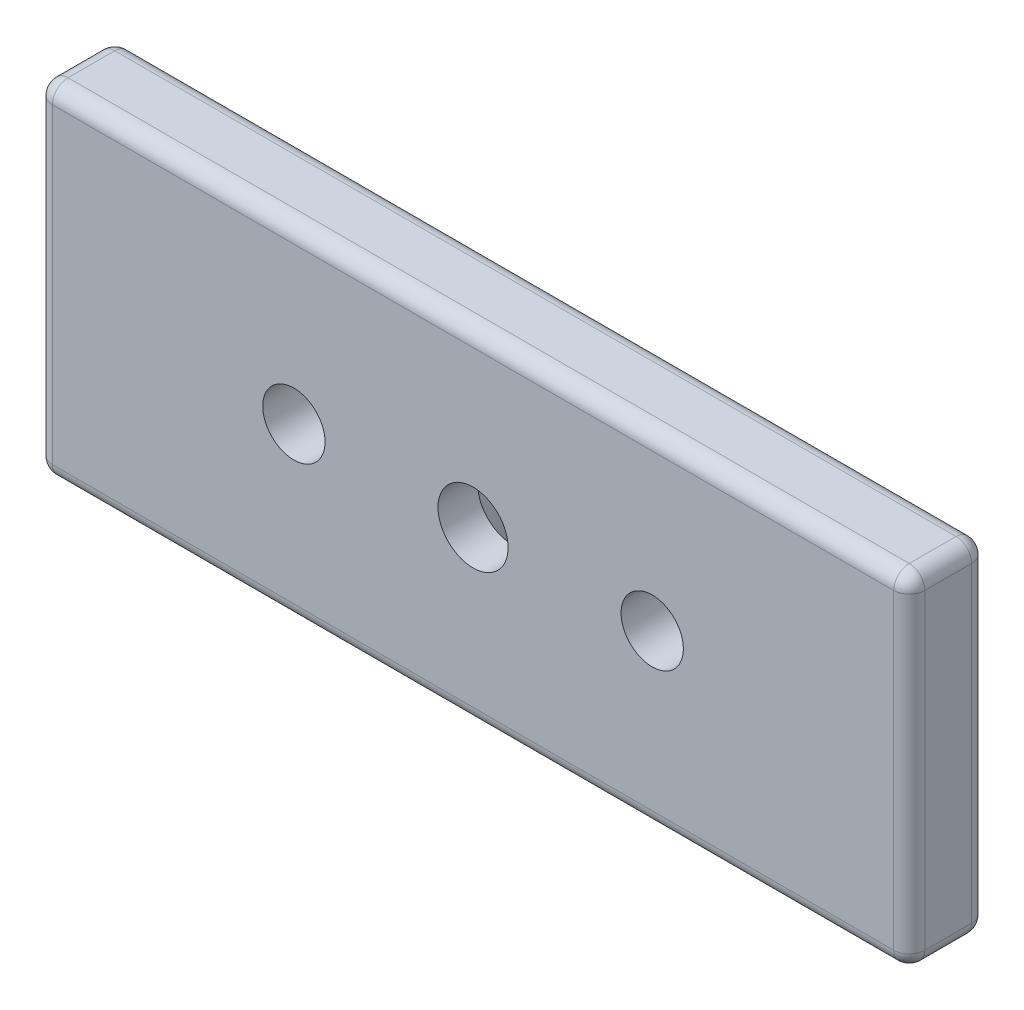
ISO-10303-21;
HEADER;
FILE_DESCRIPTION(('STEP AP214'),'2;1');
FILE_NAME('part.step','',(''),(''),'','','');
FILE_SCHEMA(('AUTOMOTIVE_DESIGN { 1 0 10303 214 1 1 1 1 }'));
ENDSEC;
DATA;
#1=APPLICATION_CONTEXT('core data for automotive mechanical design processes');
#2=APPLICATION_PROTOCOL_DEFINITION('international standard','automotive_design',2000,#1);
#3=PRODUCT_CONTEXT('',#1,'mechanical');
#4=PRODUCT('Part','Part','',(#3));
#5=PRODUCT_RELATED_PRODUCT_CATEGORY('part','',(#4));
#6=PRODUCT_DEFINITION_FORMATION('','',#4);
#7=PRODUCT_DEFINITION_CONTEXT('part definition',#1,'design');
#8=PRODUCT_DEFINITION('design','',#6,#7);
#9=PRODUCT_DEFINITION_SHAPE('','',#8);
#10=(LENGTH_UNIT() NAMED_UNIT(*) SI_UNIT(.MILLI.,.METRE.));
#11=(NAMED_UNIT(*) PLANE_ANGLE_UNIT() SI_UNIT($,.RADIAN.));
#12=(NAMED_UNIT(*) SI_UNIT($,.STERADIAN.) SOLID_ANGLE_UNIT());
#13=UNCERTAINTY_MEASURE_WITH_UNIT(LENGTH_MEASURE(1.E-05),#10,'distance_accuracy_value','');
#14=(GEOMETRIC_REPRESENTATION_CONTEXT(3) GLOBAL_UNCERTAINTY_ASSIGNED_CONTEXT((#13)) GLOBAL_UNIT_ASSIGNED_CONTEXT((#10,
#11,#12)) REPRESENTATION_CONTEXT('',''));
#15=CARTESIAN_POINT('',(0.,0.,0.));
#16=DIRECTION('',(0.,0.,1.));
#17=DIRECTION('',(1.,0.,0.));
#18=AXIS2_PLACEMENT_3D('',#15,#16,#17);
#19=CARTESIAN_POINT('',(0.,0.,-5.));
#20=DIRECTION('',(-1.,0.,0.));
#21=DIRECTION('',(0.,0.,1.));
#22=AXIS2_PLACEMENT_3D('',#19,#20,#21);
#23=PLANE('',#22);
#24=DIRECTION('',(0.,0.,1.));
#25=VECTOR('',#24,1.);
#26=CARTESIAN_POINT('',(0.,21.,-5.));
#27=LINE('',#26,#25);
#28=CARTESIAN_POINT('',(0.,21.,-1.));
#29=VERTEX_POINT('',#28);
#30=CARTESIAN_POINT('',(0.,21.,-4.));
#31=VERTEX_POINT('',#30);
#32=EDGE_CURVE('E254',#29,#31,#27,.F.);
#33=ORIENTED_EDGE('',*,*,#32,.T.);
#34=DIRECTION('',(0.,-1.,0.));
#35=VECTOR('',#34,1.);
#36=CARTESIAN_POINT('',(0.,0.,-4.));
#37=LINE('',#36,#35);
#38=CARTESIAN_POINT('',(0.,1.,-4.));
#39=VERTEX_POINT('',#38);
#40=EDGE_CURVE('E316',#31,#39,#37,.T.);
#41=ORIENTED_EDGE('',*,*,#40,.T.);
#42=DIRECTION('',(0.,0.,1.));
#43=VECTOR('',#42,1.);
#44=CARTESIAN_POINT('',(0.,1.,-5.));
#45=LINE('',#44,#43);
#46=CARTESIAN_POINT('',(0.,1.,-1.));
#47=VERTEX_POINT('',#46);
#48=EDGE_CURVE('E258',#39,#47,#45,.T.);
#49=ORIENTED_EDGE('',*,*,#48,.T.);
#50=DIRECTION('',(0.,-1.,0.));
#51=VECTOR('',#50,1.);
#52=CARTESIAN_POINT('',(0.,21.,-1.));
#53=LINE('',#52,#51);
#54=EDGE_CURVE('E313',#47,#29,#53,.F.);
#55=ORIENTED_EDGE('',*,*,#54,.T.);
#56=EDGE_LOOP('',(#33,#41,#49,#55));
#57=FACE_BOUND('',#56,.T.);
#58=ADVANCED_FACE('F40',(#57),#23,.T.);
#59=CARTESIAN_POINT('',(0.,22.,-5.));
#60=DIRECTION('',(0.,1.,0.));
#61=DIRECTION('',(0.,0.,1.));
#62=AXIS2_PLACEMENT_3D('',#59,#60,#61);
#63=PLANE('',#62);
#64=DIRECTION('',(0.,0.,1.));
#65=VECTOR('',#64,1.);
#66=CARTESIAN_POINT('',(55.,22.,-5.));
#67=LINE('',#66,#65);
#68=CARTESIAN_POINT('',(55.,22.,-1.));
#69=VERTEX_POINT('',#68);
#70=CARTESIAN_POINT('',(55.,22.,-4.));
#71=VERTEX_POINT('',#70);
#72=EDGE_CURVE('E134',#69,#71,#67,.F.);
#73=ORIENTED_EDGE('',*,*,#72,.T.);
#74=DIRECTION('',(-1.,0.,0.));
#75=VECTOR('',#74,1.);
#76=CARTESIAN_POINT('',(0.,22.,-4.));
#77=LINE('',#76,#75);
#78=CARTESIAN_POINT('',(1.,22.,-4.));
#79=VERTEX_POINT('',#78);
#80=EDGE_CURVE('E11',#71,#79,#77,.T.);
#81=ORIENTED_EDGE('',*,*,#80,.T.);
#82=DIRECTION('',(0.,0.,1.));
#83=VECTOR('',#82,1.);
#84=CARTESIAN_POINT('',(1.,22.,-5.));
#85=LINE('',#84,#83);
#86=CARTESIAN_POINT('',(1.,22.,-1.));
#87=VERTEX_POINT('',#86);
#88=EDGE_CURVE('E136',#79,#87,#85,.T.);
#89=ORIENTED_EDGE('',*,*,#88,.T.);
#90=DIRECTION('',(-1.,0.,0.));
#91=VECTOR('',#90,1.);
#92=CARTESIAN_POINT('',(55.,22.,-1.));
#93=LINE('',#92,#91);
#94=EDGE_CURVE('E50',#87,#69,#93,.F.);
#95=ORIENTED_EDGE('',*,*,#94,.T.);
#96=EDGE_LOOP('',(#73,#81,#89,#95));
#97=FACE_BOUND('',#96,.T.);
#98=ADVANCED_FACE('F133',(#97),#63,.T.);
#99=CARTESIAN_POINT('',(56.,0.,-5.));
#100=DIRECTION('',(1.,0.,0.));
#101=DIRECTION('',(0.,0.,-1.));
#102=AXIS2_PLACEMENT_3D('',#99,#100,#101);
#103=PLANE('',#102);
#104=DIRECTION('',(0.,0.,1.));
#105=VECTOR('',#104,1.);
#106=CARTESIAN_POINT('',(56.,1.,-5.));
#107=LINE('',#106,#105);
#108=CARTESIAN_POINT('',(56.,1.,-1.));
#109=VERTEX_POINT('',#108);
#110=CARTESIAN_POINT('',(56.,1.,-4.));
#111=VERTEX_POINT('',#110);
#112=EDGE_CURVE('E274',#109,#111,#107,.F.);
#113=ORIENTED_EDGE('',*,*,#112,.T.);
#114=DIRECTION('',(0.,1.,0.));
#115=VECTOR('',#114,1.);
#116=CARTESIAN_POINT('',(56.,0.,-4.));
#117=LINE('',#116,#115);
#118=CARTESIAN_POINT('',(56.,21.,-4.));
#119=VERTEX_POINT('',#118);
#120=EDGE_CURVE('E285',#111,#119,#117,.T.);
#121=ORIENTED_EDGE('',*,*,#120,.T.);
#122=DIRECTION('',(0.,0.,1.));
#123=VECTOR('',#122,1.);
#124=CARTESIAN_POINT('',(56.,21.,-5.));
#125=LINE('',#124,#123);
#126=CARTESIAN_POINT('',(56.,21.,-1.));
#127=VERTEX_POINT('',#126);
#128=EDGE_CURVE('E271',#119,#127,#125,.T.);
#129=ORIENTED_EDGE('',*,*,#128,.T.);
#130=DIRECTION('',(0.,1.,0.));
#131=VECTOR('',#130,1.);
#132=CARTESIAN_POINT('',(56.,1.,-1.));
#133=LINE('',#132,#131);
#134=EDGE_CURVE('E282',#127,#109,#133,.F.);
#135=ORIENTED_EDGE('',*,*,#134,.T.);
#136=EDGE_LOOP('',(#113,#121,#129,#135));
#137=FACE_BOUND('',#136,.T.);
#138=ADVANCED_FACE('F357',(#137),#103,.T.);
#139=CARTESIAN_POINT('',(0.,0.,-5.));
#140=DIRECTION('',(0.,-1.,0.));
#141=DIRECTION('',(0.,0.,-1.));
#142=AXIS2_PLACEMENT_3D('',#139,#140,#141);
#143=PLANE('',#142);
#144=DIRECTION('',(0.,0.,1.));
#145=VECTOR('',#144,1.);
#146=CARTESIAN_POINT('',(1.,0.,-5.));
#147=LINE('',#146,#145);
#148=CARTESIAN_POINT('',(1.,0.,-1.));
#149=VERTEX_POINT('',#148);
#150=CARTESIAN_POINT('',(1.,0.,-4.));
#151=VERTEX_POINT('',#150);
#152=EDGE_CURVE('E267',#149,#151,#147,.F.);
#153=ORIENTED_EDGE('',*,*,#152,.T.);
#154=DIRECTION('',(1.,0.,0.));
#155=VECTOR('',#154,1.);
#156=CARTESIAN_POINT('',(0.,0.,-4.));
#157=LINE('',#156,#155);
#158=CARTESIAN_POINT('',(55.,0.,-4.));
#159=VERTEX_POINT('',#158);
#160=EDGE_CURVE('E142',#151,#159,#157,.T.);
#161=ORIENTED_EDGE('',*,*,#160,.T.);
#162=DIRECTION('',(0.,0.,1.));
#163=VECTOR('',#162,1.);
#164=CARTESIAN_POINT('',(55.,0.,-5.));
#165=LINE('',#164,#163);
#166=CARTESIAN_POINT('',(55.,0.,-1.));
#167=VERTEX_POINT('',#166);
#168=EDGE_CURVE('E263',#159,#167,#165,.T.);
#169=ORIENTED_EDGE('',*,*,#168,.T.);
#170=DIRECTION('',(1.,0.,0.));
#171=VECTOR('',#170,1.);
#172=CARTESIAN_POINT('',(1.,0.,-1.));
#173=LINE('',#172,#171);
#174=EDGE_CURVE('E334',#167,#149,#173,.F.);
#175=ORIENTED_EDGE('',*,*,#174,.T.);
#176=EDGE_LOOP('',(#153,#161,#169,#175));
#177=FACE_BOUND('',#176,.T.);
#178=ADVANCED_FACE('F340',(#177),#143,.T.);
#179=CARTESIAN_POINT('',(0.,0.,-5.));
#180=DIRECTION('',(0.,0.,-1.));
#181=DIRECTION('',(-1.,0.,0.));
#182=AXIS2_PLACEMENT_3D('',#179,#180,#181);
#183=PLANE('',#182);
#184=CARTESIAN_POINT('',(28.,11.,-5.));
#185=DIRECTION('',(0.,0.,-1.));
#186=DIRECTION('',(-1.,0.,0.));
#187=AXIS2_PLACEMENT_3D('',#184,#185,#186);
#188=CIRCLE('',#187,4.7);
#189=CARTESIAN_POINT('',(23.3,11.,-5.));
#190=VERTEX_POINT('',#189);
#191=EDGE_CURVE('E660',#190,#190,#188,.T.);
#192=ORIENTED_EDGE('',*,*,#191,.F.);
#193=EDGE_LOOP('',(#192));
#194=FACE_BOUND('',#193,.T.);
#195=DIRECTION('',(0.,1.,0.));
#196=VECTOR('',#195,1.);
#197=CARTESIAN_POINT('',(55.,0.,-5.));
#198=LINE('',#197,#196);
#199=CARTESIAN_POINT('',(55.,21.,-5.));
#200=VERTEX_POINT('',#199);
#201=CARTESIAN_POINT('',(55.,1.,-5.));
#202=VERTEX_POINT('',#201);
#203=EDGE_CURVE('E294',#200,#202,#198,.F.);
#204=ORIENTED_EDGE('',*,*,#203,.T.);
#205=DIRECTION('',(1.,0.,0.));
#206=VECTOR('',#205,1.);
#207=CARTESIAN_POINT('',(0.,1.,-5.));
#208=LINE('',#207,#206);
#209=CARTESIAN_POINT('',(1.,1.,-5.));
#210=VERTEX_POINT('',#209);
#211=EDGE_CURVE('E298',#202,#210,#208,.F.);
#212=ORIENTED_EDGE('',*,*,#211,.T.);
#213=DIRECTION('',(0.,-1.,0.));
#214=VECTOR('',#213,1.);
#215=CARTESIAN_POINT('',(1.,0.,-5.));
#216=LINE('',#215,#214);
#217=CARTESIAN_POINT('',(1.,21.,-5.));
#218=VERTEX_POINT('',#217);
#219=EDGE_CURVE('E291',#210,#218,#216,.F.);
#220=ORIENTED_EDGE('',*,*,#219,.T.);
#221=DIRECTION('',(-1.,0.,0.));
#222=VECTOR('',#221,1.);
#223=CARTESIAN_POINT('',(0.,21.,-5.));
#224=LINE('',#223,#222);
#225=EDGE_CURVE('E288',#218,#200,#224,.F.);
#226=ORIENTED_EDGE('',*,*,#225,.T.);
#227=EDGE_LOOP('',(#204,#212,#220,#226));
#228=FACE_BOUND('',#227,.T.);
#229=CARTESIAN_POINT('',(16.5,11.,-5.));
#230=DIRECTION('',(0.,0.,1.));
#231=DIRECTION('',(1.,0.,0.));
#232=AXIS2_PLACEMENT_3D('',#229,#230,#231);
#233=CIRCLE('',#232,2.);
#234=CARTESIAN_POINT('',(18.5,11.,-5.));
#235=VERTEX_POINT('',#234);
#236=EDGE_CURVE('E259',#235,#235,#233,.T.);
#237=ORIENTED_EDGE('',*,*,#236,.T.);
#238=EDGE_LOOP('',(#237));
#239=FACE_BOUND('',#238,.T.);
#240=CARTESIAN_POINT('',(39.5,11.,-5.));
#241=DIRECTION('',(0.,0.,1.));
#242=DIRECTION('',(1.,0.,0.));
#243=AXIS2_PLACEMENT_3D('',#240,#241,#242);
#244=CIRCLE('',#243,2.);
#245=CARTESIAN_POINT('',(41.5,11.,-5.));
#246=VERTEX_POINT('',#245);
#247=EDGE_CURVE('E244',#246,#246,#244,.T.);
#248=ORIENTED_EDGE('',*,*,#247,.T.);
#249=EDGE_LOOP('',(#248));
#250=FACE_BOUND('',#249,.T.);
#251=ADVANCED_FACE('F616',(#194,#228,#239,#250),#183,.T.);
#252=CARTESIAN_POINT('',(0.,0.,0.));
#253=DIRECTION('',(0.,0.,-1.));
#254=DIRECTION('',(-1.,0.,0.));
#255=AXIS2_PLACEMENT_3D('',#252,#253,#254);
#256=PLANE('',#255);
#257=CARTESIAN_POINT('',(28.,11.,0.));
#258=DIRECTION('',(0.,0.,-1.));
#259=DIRECTION('',(-1.,0.,0.));
#260=AXIS2_PLACEMENT_3D('',#257,#258,#259);
#261=CIRCLE('',#260,2.25);
#262=CARTESIAN_POINT('',(25.75,11.,0.));
#263=VERTEX_POINT('',#262);
#264=EDGE_CURVE('E168',#263,#263,#261,.T.);
#265=ORIENTED_EDGE('',*,*,#264,.T.);
#266=EDGE_LOOP('',(#265));
#267=FACE_BOUND('',#266,.T.);
#268=DIRECTION('',(0.,-1.,0.));
#269=VECTOR('',#268,1.);
#270=CARTESIAN_POINT('',(1.,1.,0.));
#271=LINE('',#270,#269);
#272=CARTESIAN_POINT('',(1.,21.,0.));
#273=VERTEX_POINT('',#272);
#274=CARTESIAN_POINT('',(1.,1.,0.));
#275=VERTEX_POINT('',#274);
#276=EDGE_CURVE('E63',#273,#275,#271,.T.);
#277=ORIENTED_EDGE('',*,*,#276,.T.);
#278=DIRECTION('',(1.,0.,0.));
#279=VECTOR('',#278,1.);
#280=CARTESIAN_POINT('',(55.,1.,0.));
#281=LINE('',#280,#279);
#282=CARTESIAN_POINT('',(55.,1.,0.));
#283=VERTEX_POINT('',#282);
#284=EDGE_CURVE('E58',#275,#283,#281,.T.);
#285=ORIENTED_EDGE('',*,*,#284,.T.);
#286=DIRECTION('',(0.,1.,0.));
#287=VECTOR('',#286,1.);
#288=CARTESIAN_POINT('',(55.,21.,0.));
#289=LINE('',#288,#287);
#290=CARTESIAN_POINT('',(55.,21.,0.));
#291=VERTEX_POINT('',#290);
#292=EDGE_CURVE('E329',#283,#291,#289,.T.);
#293=ORIENTED_EDGE('',*,*,#292,.T.);
#294=DIRECTION('',(-1.,0.,0.));
#295=VECTOR('',#294,1.);
#296=CARTESIAN_POINT('',(1.,21.,0.));
#297=LINE('',#296,#295);
#298=EDGE_CURVE('E166',#291,#273,#297,.T.);
#299=ORIENTED_EDGE('',*,*,#298,.T.);
#300=EDGE_LOOP('',(#277,#285,#293,#299));
#301=FACE_BOUND('',#300,.T.);
#302=CARTESIAN_POINT('',(16.5,11.,0.));
#303=DIRECTION('',(0.,0.,1.));
#304=DIRECTION('',(1.,0.,0.));
#305=AXIS2_PLACEMENT_3D('',#302,#303,#304);
#306=CIRCLE('',#305,2.);
#307=CARTESIAN_POINT('',(18.5,11.,0.));
#308=VERTEX_POINT('',#307);
#309=EDGE_CURVE('E250',#308,#308,#306,.T.);
#310=ORIENTED_EDGE('',*,*,#309,.F.);
#311=EDGE_LOOP('',(#310));
#312=FACE_BOUND('',#311,.T.);
#313=CARTESIAN_POINT('',(39.5,11.,0.));
#314=DIRECTION('',(0.,0.,1.));
#315=DIRECTION('',(1.,0.,0.));
#316=AXIS2_PLACEMENT_3D('',#313,#314,#315);
#317=CIRCLE('',#316,2.);
#318=CARTESIAN_POINT('',(41.5,11.,0.));
#319=VERTEX_POINT('',#318);
#320=EDGE_CURVE('E238',#319,#319,#317,.T.);
#321=ORIENTED_EDGE('',*,*,#320,.F.);
#322=EDGE_LOOP('',(#321));
#323=FACE_BOUND('',#322,.T.);
#324=ADVANCED_FACE('F608',(#267,#301,#312,#323),#256,.F.);
#325=CARTESIAN_POINT('',(39.5,11.,-5.));
#326=DIRECTION('',(0.,0.,1.));
#327=DIRECTION('',(1.,0.,0.));
#328=AXIS2_PLACEMENT_3D('',#325,#326,#327);
#329=CYLINDRICAL_SURFACE('',#328,2.);
#330=ORIENTED_EDGE('',*,*,#247,.F.);
#331=EDGE_LOOP('',(#330));
#332=FACE_BOUND('',#331,.T.);
#333=ORIENTED_EDGE('',*,*,#320,.T.);
#334=EDGE_LOOP('',(#333));
#335=FACE_BOUND('',#334,.T.);
#336=ADVANCED_FACE('F599',(#332,#335),#329,.F.);
#337=CARTESIAN_POINT('',(16.5,11.,-5.));
#338=DIRECTION('',(0.,0.,1.));
#339=DIRECTION('',(1.,0.,0.));
#340=AXIS2_PLACEMENT_3D('',#337,#338,#339);
#341=CYLINDRICAL_SURFACE('',#340,2.);
#342=ORIENTED_EDGE('',*,*,#236,.F.);
#343=EDGE_LOOP('',(#342));
#344=FACE_BOUND('',#343,.T.);
#345=ORIENTED_EDGE('',*,*,#309,.T.);
#346=EDGE_LOOP('',(#345));
#347=FACE_BOUND('',#346,.T.);
#348=ADVANCED_FACE('F402',(#344,#347),#341,.F.);
#349=CARTESIAN_POINT('',(1.,1.,-5.));
#350=DIRECTION('',(0.,0.,1.));
#351=DIRECTION('',(1.,0.,0.));
#352=AXIS2_PLACEMENT_3D('',#349,#350,#351);
#353=CYLINDRICAL_SURFACE('',#352,1.);
#354=ORIENTED_EDGE('',*,*,#48,.F.);
#355=CARTESIAN_POINT('',(1.,1.,-4.));
#356=DIRECTION('',(0.,0.,1.));
#357=DIRECTION('',(1.,0.,0.));
#358=AXIS2_PLACEMENT_3D('',#355,#356,#357);
#359=CIRCLE('',#358,1.);
#360=EDGE_CURVE('E310',#39,#151,#359,.T.);
#361=ORIENTED_EDGE('',*,*,#360,.T.);
#362=ORIENTED_EDGE('',*,*,#152,.F.);
#363=CARTESIAN_POINT('',(1.,1.,-1.));
#364=DIRECTION('',(0.,0.,1.));
#365=DIRECTION('',(1.,0.,0.));
#366=AXIS2_PLACEMENT_3D('',#363,#364,#365);
#367=CIRCLE('',#366,1.);
#368=EDGE_CURVE('E307',#149,#47,#367,.F.);
#369=ORIENTED_EDGE('',*,*,#368,.T.);
#370=EDGE_LOOP('',(#354,#361,#362,#369));
#371=FACE_BOUND('',#370,.T.);
#372=ADVANCED_FACE('F378',(#371),#353,.T.);
#373=CARTESIAN_POINT('',(55.,1.,-5.));
#374=DIRECTION('',(0.,0.,1.));
#375=DIRECTION('',(1.,0.,0.));
#376=AXIS2_PLACEMENT_3D('',#373,#374,#375);
#377=CYLINDRICAL_SURFACE('',#376,1.);
#378=ORIENTED_EDGE('',*,*,#168,.F.);
#379=CARTESIAN_POINT('',(55.,1.,-4.));
#380=DIRECTION('',(0.,0.,1.));
#381=DIRECTION('',(1.,0.,0.));
#382=AXIS2_PLACEMENT_3D('',#379,#380,#381);
#383=CIRCLE('',#382,1.);
#384=EDGE_CURVE('E304',#159,#111,#383,.T.);
#385=ORIENTED_EDGE('',*,*,#384,.T.);
#386=ORIENTED_EDGE('',*,*,#112,.F.);
#387=CARTESIAN_POINT('',(55.,1.,-1.));
#388=DIRECTION('',(0.,0.,1.));
#389=DIRECTION('',(1.,0.,0.));
#390=AXIS2_PLACEMENT_3D('',#387,#388,#389);
#391=CIRCLE('',#390,1.);
#392=EDGE_CURVE('E301',#109,#167,#391,.F.);
#393=ORIENTED_EDGE('',*,*,#392,.T.);
#394=EDGE_LOOP('',(#378,#385,#386,#393));
#395=FACE_BOUND('',#394,.T.);
#396=ADVANCED_FACE('F344',(#395),#377,.T.);
#397=CARTESIAN_POINT('',(55.,21.,-5.));
#398=DIRECTION('',(0.,0.,1.));
#399=DIRECTION('',(1.,0.,0.));
#400=AXIS2_PLACEMENT_3D('',#397,#398,#399);
#401=CYLINDRICAL_SURFACE('',#400,1.);
#402=ORIENTED_EDGE('',*,*,#128,.F.);
#403=CARTESIAN_POINT('',(55.,21.,-4.));
#404=DIRECTION('',(0.,0.,1.));
#405=DIRECTION('',(1.,0.,0.));
#406=AXIS2_PLACEMENT_3D('',#403,#404,#405);
#407=CIRCLE('',#406,1.);
#408=EDGE_CURVE('E153',#119,#71,#407,.T.);
#409=ORIENTED_EDGE('',*,*,#408,.T.);
#410=ORIENTED_EDGE('',*,*,#72,.F.);
#411=CARTESIAN_POINT('',(55.,21.,-1.));
#412=DIRECTION('',(0.,0.,1.));
#413=DIRECTION('',(1.,0.,0.));
#414=AXIS2_PLACEMENT_3D('',#411,#412,#413);
#415=CIRCLE('',#414,1.);
#416=EDGE_CURVE('E150',#69,#127,#415,.F.);
#417=ORIENTED_EDGE('',*,*,#416,.T.);
#418=EDGE_LOOP('',(#402,#409,#410,#417));
#419=FACE_BOUND('',#418,.T.);
#420=ADVANCED_FACE('F149',(#419),#401,.T.);
#421=CARTESIAN_POINT('',(1.,21.,-5.));
#422=DIRECTION('',(0.,0.,1.));
#423=DIRECTION('',(1.,0.,0.));
#424=AXIS2_PLACEMENT_3D('',#421,#422,#423);
#425=CYLINDRICAL_SURFACE('',#424,1.);
#426=ORIENTED_EDGE('',*,*,#88,.F.);
#427=CARTESIAN_POINT('',(1.,21.,-4.));
#428=DIRECTION('',(0.,0.,1.));
#429=DIRECTION('',(1.,0.,0.));
#430=AXIS2_PLACEMENT_3D('',#427,#428,#429);
#431=CIRCLE('',#430,1.);
#432=EDGE_CURVE('E322',#79,#31,#431,.T.);
#433=ORIENTED_EDGE('',*,*,#432,.T.);
#434=ORIENTED_EDGE('',*,*,#32,.F.);
#435=CARTESIAN_POINT('',(1.,21.,-1.));
#436=DIRECTION('',(0.,0.,1.));
#437=DIRECTION('',(1.,0.,0.));
#438=AXIS2_PLACEMENT_3D('',#435,#436,#437);
#439=CIRCLE('',#438,1.);
#440=EDGE_CURVE('E319',#29,#87,#439,.F.);
#441=ORIENTED_EDGE('',*,*,#440,.T.);
#442=EDGE_LOOP('',(#426,#433,#434,#441));
#443=FACE_BOUND('',#442,.T.);
#444=ADVANCED_FACE('F367',(#443),#425,.T.);
#445=CARTESIAN_POINT('',(1.,1.,-4.));
#446=DIRECTION('',(0.,0.,-1.));
#447=DIRECTION('',(-1.,0.,0.));
#448=AXIS2_PLACEMENT_3D('',#445,#446,#447);
#449=SPHERICAL_SURFACE('',#448,1.);
#450=CARTESIAN_POINT('',(1.,1.,-4.));
#451=DIRECTION('',(1.,0.,0.));
#452=DIRECTION('',(0.,0.,-1.));
#453=AXIS2_PLACEMENT_3D('',#450,#451,#452);
#454=CIRCLE('',#453,1.);
#455=EDGE_CURVE('E228',#151,#210,#454,.T.);
#456=ORIENTED_EDGE('',*,*,#455,.F.);
#457=ORIENTED_EDGE('',*,*,#360,.F.);
#458=CARTESIAN_POINT('',(1.,1.,-4.));
#459=DIRECTION('',(0.,1.,0.));
#460=DIRECTION('',(0.,0.,1.));
#461=AXIS2_PLACEMENT_3D('',#458,#459,#460);
#462=CIRCLE('',#461,1.);
#463=EDGE_CURVE('E178',#210,#39,#462,.T.);
#464=ORIENTED_EDGE('',*,*,#463,.F.);
#465=EDGE_LOOP('',(#456,#457,#464));
#466=FACE_BOUND('',#465,.T.);
#467=ADVANCED_FACE('F381',(#466),#449,.T.);
#468=CARTESIAN_POINT('',(1.,0.,-4.));
#469=DIRECTION('',(0.,-1.,0.));
#470=DIRECTION('',(0.,0.,-1.));
#471=AXIS2_PLACEMENT_3D('',#468,#469,#470);
#472=CYLINDRICAL_SURFACE('',#471,1.);
#473=ORIENTED_EDGE('',*,*,#463,.T.);
#474=ORIENTED_EDGE('',*,*,#40,.F.);
#475=CARTESIAN_POINT('',(1.,21.,-4.));
#476=DIRECTION('',(0.,1.,0.));
#477=DIRECTION('',(0.,0.,1.));
#478=AXIS2_PLACEMENT_3D('',#475,#476,#477);
#479=CIRCLE('',#478,1.);
#480=EDGE_CURVE('E225',#218,#31,#479,.T.);
#481=ORIENTED_EDGE('',*,*,#480,.F.);
#482=ORIENTED_EDGE('',*,*,#219,.F.);
#483=EDGE_LOOP('',(#473,#474,#481,#482));
#484=FACE_BOUND('',#483,.T.);
#485=ADVANCED_FACE('F373',(#484),#472,.T.);
#486=CARTESIAN_POINT('',(0.,1.,-4.));
#487=DIRECTION('',(1.,0.,0.));
#488=DIRECTION('',(0.,0.,-1.));
#489=AXIS2_PLACEMENT_3D('',#486,#487,#488);
#490=CYLINDRICAL_SURFACE('',#489,1.);
#491=ORIENTED_EDGE('',*,*,#455,.T.);
#492=ORIENTED_EDGE('',*,*,#211,.F.);
#493=CARTESIAN_POINT('',(55.,1.,-4.));
#494=DIRECTION('',(1.,0.,0.));
#495=DIRECTION('',(0.,0.,-1.));
#496=AXIS2_PLACEMENT_3D('',#493,#494,#495);
#497=CIRCLE('',#496,1.);
#498=EDGE_CURVE('E221',#159,#202,#497,.T.);
#499=ORIENTED_EDGE('',*,*,#498,.F.);
#500=ORIENTED_EDGE('',*,*,#160,.F.);
#501=EDGE_LOOP('',(#491,#492,#499,#500));
#502=FACE_BOUND('',#501,.T.);
#503=ADVANCED_FACE('F348',(#502),#490,.T.);
#504=CARTESIAN_POINT('',(1.,21.,-4.));
#505=DIRECTION('',(0.,0.,-1.));
#506=DIRECTION('',(-1.,0.,0.));
#507=AXIS2_PLACEMENT_3D('',#504,#505,#506);
#508=SPHERICAL_SURFACE('',#507,1.);
#509=ORIENTED_EDGE('',*,*,#480,.T.);
#510=ORIENTED_EDGE('',*,*,#432,.F.);
#511=CARTESIAN_POINT('',(1.,21.,-4.));
#512=DIRECTION('',(1.,0.,0.));
#513=DIRECTION('',(0.,0.,-1.));
#514=AXIS2_PLACEMENT_3D('',#511,#512,#513);
#515=CIRCLE('',#514,1.);
#516=EDGE_CURVE('E217',#218,#79,#515,.T.);
#517=ORIENTED_EDGE('',*,*,#516,.F.);
#518=EDGE_LOOP('',(#509,#510,#517));
#519=FACE_BOUND('',#518,.T.);
#520=ADVANCED_FACE('F371',(#519),#508,.T.);
#521=CARTESIAN_POINT('',(55.,1.,-4.));
#522=DIRECTION('',(0.,0.,-1.));
#523=DIRECTION('',(-1.,0.,0.));
#524=AXIS2_PLACEMENT_3D('',#521,#522,#523);
#525=SPHERICAL_SURFACE('',#524,1.);
#526=ORIENTED_EDGE('',*,*,#384,.F.);
#527=ORIENTED_EDGE('',*,*,#498,.T.);
#528=CARTESIAN_POINT('',(55.,1.,-4.));
#529=DIRECTION('',(0.,1.,0.));
#530=DIRECTION('',(0.,0.,1.));
#531=AXIS2_PLACEMENT_3D('',#528,#529,#530);
#532=CIRCLE('',#531,1.);
#533=EDGE_CURVE('E212',#111,#202,#532,.T.);
#534=ORIENTED_EDGE('',*,*,#533,.F.);
#535=EDGE_LOOP('',(#526,#527,#534));
#536=FACE_BOUND('',#535,.T.);
#537=ADVANCED_FACE('F351',(#536),#525,.T.);
#538=CARTESIAN_POINT('',(0.,21.,-4.));
#539=DIRECTION('',(-1.,0.,0.));
#540=DIRECTION('',(0.,0.,1.));
#541=AXIS2_PLACEMENT_3D('',#538,#539,#540);
#542=CYLINDRICAL_SURFACE('',#541,1.);
#543=ORIENTED_EDGE('',*,*,#516,.T.);
#544=ORIENTED_EDGE('',*,*,#80,.F.);
#545=CARTESIAN_POINT('',(55.,21.,-4.));
#546=DIRECTION('',(1.,0.,0.));
#547=DIRECTION('',(0.,0.,-1.));
#548=AXIS2_PLACEMENT_3D('',#545,#546,#547);
#549=CIRCLE('',#548,1.);
#550=EDGE_CURVE('E207',#200,#71,#549,.T.);
#551=ORIENTED_EDGE('',*,*,#550,.F.);
#552=ORIENTED_EDGE('',*,*,#225,.F.);
#553=EDGE_LOOP('',(#543,#544,#551,#552));
#554=FACE_BOUND('',#553,.T.);
#555=ADVANCED_FACE('F363',(#554),#542,.T.);
#556=CARTESIAN_POINT('',(55.,0.,-4.));
#557=DIRECTION('',(0.,1.,0.));
#558=DIRECTION('',(0.,0.,1.));
#559=AXIS2_PLACEMENT_3D('',#556,#557,#558);
#560=CYLINDRICAL_SURFACE('',#559,1.);
#561=ORIENTED_EDGE('',*,*,#533,.T.);
#562=ORIENTED_EDGE('',*,*,#203,.F.);
#563=CARTESIAN_POINT('',(55.,21.,-4.));
#564=DIRECTION('',(0.,1.,0.));
#565=DIRECTION('',(0.,0.,1.));
#566=AXIS2_PLACEMENT_3D('',#563,#564,#565);
#567=CIRCLE('',#566,1.);
#568=EDGE_CURVE('E202',#119,#200,#567,.T.);
#569=ORIENTED_EDGE('',*,*,#568,.F.);
#570=ORIENTED_EDGE('',*,*,#120,.F.);
#571=EDGE_LOOP('',(#561,#562,#569,#570));
#572=FACE_BOUND('',#571,.T.);
#573=ADVANCED_FACE('F355',(#572),#560,.T.);
#574=CARTESIAN_POINT('',(55.,21.,-4.));
#575=DIRECTION('',(0.,0.,-1.));
#576=DIRECTION('',(-1.,0.,0.));
#577=AXIS2_PLACEMENT_3D('',#574,#575,#576);
#578=SPHERICAL_SURFACE('',#577,1.);
#579=ORIENTED_EDGE('',*,*,#550,.T.);
#580=ORIENTED_EDGE('',*,*,#408,.F.);
#581=ORIENTED_EDGE('',*,*,#568,.T.);
#582=EDGE_LOOP('',(#579,#580,#581));
#583=FACE_BOUND('',#582,.T.);
#584=ADVANCED_FACE('F358',(#583),#578,.T.);
#585=CARTESIAN_POINT('',(1.,1.,-1.));
#586=DIRECTION('',(0.,0.,-1.));
#587=DIRECTION('',(-1.,0.,0.));
#588=AXIS2_PLACEMENT_3D('',#585,#586,#587);
#589=SPHERICAL_SURFACE('',#588,1.);
#590=CARTESIAN_POINT('',(1.,1.,-1.));
#591=DIRECTION('',(0.,1.,0.));
#592=DIRECTION('',(0.,0.,1.));
#593=AXIS2_PLACEMENT_3D('',#590,#591,#592);
#594=CIRCLE('',#593,1.);
#595=EDGE_CURVE('E194',#47,#275,#594,.T.);
#596=ORIENTED_EDGE('',*,*,#595,.F.);
#597=ORIENTED_EDGE('',*,*,#368,.F.);
#598=CARTESIAN_POINT('',(1.,1.,-1.));
#599=DIRECTION('',(1.,0.,0.));
#600=DIRECTION('',(0.,0.,-1.));
#601=AXIS2_PLACEMENT_3D('',#598,#599,#600);
#602=CIRCLE('',#601,1.);
#603=EDGE_CURVE('E44',#275,#149,#602,.T.);
#604=ORIENTED_EDGE('',*,*,#603,.F.);
#605=EDGE_LOOP('',(#596,#597,#604));
#606=FACE_BOUND('',#605,.T.);
#607=ADVANCED_FACE('F42',(#606),#589,.T.);
#608=CARTESIAN_POINT('',(0.,1.,-1.));
#609=DIRECTION('',(-1.,0.,0.));
#610=DIRECTION('',(0.,0.,1.));
#611=AXIS2_PLACEMENT_3D('',#608,#609,#610);
#612=CYLINDRICAL_SURFACE('',#611,1.);
#613=ORIENTED_EDGE('',*,*,#603,.T.);
#614=ORIENTED_EDGE('',*,*,#174,.F.);
#615=CARTESIAN_POINT('',(55.,1.,-1.));
#616=DIRECTION('',(1.,0.,0.));
#617=DIRECTION('',(0.,0.,-1.));
#618=AXIS2_PLACEMENT_3D('',#615,#616,#617);
#619=CIRCLE('',#618,1.);
#620=EDGE_CURVE('E191',#283,#167,#619,.T.);
#621=ORIENTED_EDGE('',*,*,#620,.F.);
#622=ORIENTED_EDGE('',*,*,#284,.F.);
#623=EDGE_LOOP('',(#613,#614,#621,#622));
#624=FACE_BOUND('',#623,.T.);
#625=ADVANCED_FACE('F448',(#624),#612,.T.);
#626=CARTESIAN_POINT('',(1.,0.,-1.));
#627=DIRECTION('',(0.,1.,0.));
#628=DIRECTION('',(0.,0.,1.));
#629=AXIS2_PLACEMENT_3D('',#626,#627,#628);
#630=CYLINDRICAL_SURFACE('',#629,1.);
#631=ORIENTED_EDGE('',*,*,#595,.T.);
#632=ORIENTED_EDGE('',*,*,#276,.F.);
#633=CARTESIAN_POINT('',(1.,21.,-1.));
#634=DIRECTION('',(0.,1.,0.));
#635=DIRECTION('',(0.,0.,1.));
#636=AXIS2_PLACEMENT_3D('',#633,#634,#635);
#637=CIRCLE('',#636,1.);
#638=EDGE_CURVE('E187',#29,#273,#637,.T.);
#639=ORIENTED_EDGE('',*,*,#638,.F.);
#640=ORIENTED_EDGE('',*,*,#54,.F.);
#641=EDGE_LOOP('',(#631,#632,#639,#640));
#642=FACE_BOUND('',#641,.T.);
#643=ADVANCED_FACE('F455',(#642),#630,.T.);
#644=CARTESIAN_POINT('',(55.,1.,-1.));
#645=DIRECTION('',(0.,0.,-1.));
#646=DIRECTION('',(-1.,0.,0.));
#647=AXIS2_PLACEMENT_3D('',#644,#645,#646);
#648=SPHERICAL_SURFACE('',#647,1.);
#649=ORIENTED_EDGE('',*,*,#620,.T.);
#650=ORIENTED_EDGE('',*,*,#392,.F.);
#651=CARTESIAN_POINT('',(55.,1.,-1.));
#652=DIRECTION('',(0.,1.,0.));
#653=DIRECTION('',(0.,0.,1.));
#654=AXIS2_PLACEMENT_3D('',#651,#652,#653);
#655=CIRCLE('',#654,1.);
#656=EDGE_CURVE('E183',#283,#109,#655,.T.);
#657=ORIENTED_EDGE('',*,*,#656,.F.);
#658=EDGE_LOOP('',(#649,#650,#657));
#659=FACE_BOUND('',#658,.T.);
#660=ADVANCED_FACE('F461',(#659),#648,.T.);
#661=CARTESIAN_POINT('',(1.,21.,-1.));
#662=DIRECTION('',(0.,0.,-1.));
#663=DIRECTION('',(-1.,0.,0.));
#664=AXIS2_PLACEMENT_3D('',#661,#662,#663);
#665=SPHERICAL_SURFACE('',#664,1.);
#666=ORIENTED_EDGE('',*,*,#440,.F.);
#667=ORIENTED_EDGE('',*,*,#638,.T.);
#668=CARTESIAN_POINT('',(1.,21.,-1.));
#669=DIRECTION('',(1.,0.,0.));
#670=DIRECTION('',(0.,0.,-1.));
#671=AXIS2_PLACEMENT_3D('',#668,#669,#670);
#672=CIRCLE('',#671,1.);
#673=EDGE_CURVE('E172',#87,#273,#672,.T.);
#674=ORIENTED_EDGE('',*,*,#673,.F.);
#675=EDGE_LOOP('',(#666,#667,#674));
#676=FACE_BOUND('',#675,.T.);
#677=ADVANCED_FACE('F468',(#676),#665,.T.);
#678=CARTESIAN_POINT('',(55.,0.,-1.));
#679=DIRECTION('',(0.,-1.,0.));
#680=DIRECTION('',(0.,0.,-1.));
#681=AXIS2_PLACEMENT_3D('',#678,#679,#680);
#682=CYLINDRICAL_SURFACE('',#681,1.);
#683=ORIENTED_EDGE('',*,*,#656,.T.);
#684=ORIENTED_EDGE('',*,*,#134,.F.);
#685=CARTESIAN_POINT('',(55.,21.,-1.));
#686=DIRECTION('',(0.,1.,0.));
#687=DIRECTION('',(0.,0.,1.));
#688=AXIS2_PLACEMENT_3D('',#685,#686,#687);
#689=CIRCLE('',#688,1.);
#690=EDGE_CURVE('E160',#291,#127,#689,.T.);
#691=ORIENTED_EDGE('',*,*,#690,.F.);
#692=ORIENTED_EDGE('',*,*,#292,.F.);
#693=EDGE_LOOP('',(#683,#684,#691,#692));
#694=FACE_BOUND('',#693,.T.);
#695=ADVANCED_FACE('F476',(#694),#682,.T.);
#696=CARTESIAN_POINT('',(0.,21.,-1.));
#697=DIRECTION('',(1.,0.,0.));
#698=DIRECTION('',(0.,0.,-1.));
#699=AXIS2_PLACEMENT_3D('',#696,#697,#698);
#700=CYLINDRICAL_SURFACE('',#699,1.);
#701=ORIENTED_EDGE('',*,*,#673,.T.);
#702=ORIENTED_EDGE('',*,*,#298,.F.);
#703=CARTESIAN_POINT('',(55.,21.,-1.));
#704=DIRECTION('',(1.,0.,0.));
#705=DIRECTION('',(0.,0.,-1.));
#706=AXIS2_PLACEMENT_3D('',#703,#704,#705);
#707=CIRCLE('',#706,1.);
#708=EDGE_CURVE('E158',#69,#291,#707,.T.);
#709=ORIENTED_EDGE('',*,*,#708,.F.);
#710=ORIENTED_EDGE('',*,*,#94,.F.);
#711=EDGE_LOOP('',(#701,#702,#709,#710));
#712=FACE_BOUND('',#711,.T.);
#713=ADVANCED_FACE('F165',(#712),#700,.T.);
#714=CARTESIAN_POINT('',(55.,21.,-1.));
#715=DIRECTION('',(0.,0.,-1.));
#716=DIRECTION('',(-1.,0.,0.));
#717=AXIS2_PLACEMENT_3D('',#714,#715,#716);
#718=SPHERICAL_SURFACE('',#717,1.);
#719=ORIENTED_EDGE('',*,*,#690,.T.);
#720=ORIENTED_EDGE('',*,*,#416,.F.);
#721=ORIENTED_EDGE('',*,*,#708,.T.);
#722=EDGE_LOOP('',(#719,#720,#721));
#723=FACE_BOUND('',#722,.T.);
#724=ADVANCED_FACE('F157',(#723),#718,.T.);
#725=CARTESIAN_POINT('',(28.,11.,-5.));
#726=DIRECTION('',(0.,0.,-1.));
#727=DIRECTION('',(-1.,0.,0.));
#728=AXIS2_PLACEMENT_3D('',#725,#726,#727);
#729=CYLINDRICAL_SURFACE('',#728,2.24999999999999);
#730=ORIENTED_EDGE('',*,*,#264,.F.);
#731=EDGE_LOOP('',(#730));
#732=FACE_BOUND('',#731,.T.);
#733=CARTESIAN_POINT('',(28.,11.,-2.54999999999999));
#734=DIRECTION('',(0.,0.,-1.));
#735=DIRECTION('',(-1.,0.,0.));
#736=AXIS2_PLACEMENT_3D('',#733,#734,#735);
#737=CIRCLE('',#736,2.24999999999999);
#738=CARTESIAN_POINT('',(25.75,11.,-2.54999999999999));
#739=VERTEX_POINT('',#738);
#740=EDGE_CURVE('E175',#739,#739,#737,.T.);
#741=ORIENTED_EDGE('',*,*,#740,.T.);
#742=EDGE_LOOP('',(#741));
#743=FACE_BOUND('',#742,.T.);
#744=ADVANCED_FACE('F497',(#732,#743),#729,.F.);
#745=CARTESIAN_POINT('',(28.,11.,-5.));
#746=DIRECTION('',(0.,0.,-1.));
#747=DIRECTION('',(-1.,0.,0.));
#748=AXIS2_PLACEMENT_3D('',#745,#746,#747);
#749=CONICAL_SURFACE('',#748,4.7,0.785398163397449);
#750=ORIENTED_EDGE('',*,*,#740,.F.);
#751=EDGE_LOOP('',(#750));
#752=FACE_BOUND('',#751,.T.);
#753=ORIENTED_EDGE('',*,*,#191,.T.);
#754=EDGE_LOOP('',(#753));
#755=FACE_BOUND('',#754,.T.);
#756=ADVANCED_FACE('F504',(#752,#755),#749,.F.);
#757=CLOSED_SHELL('',(#58,#98,#138,#178,#251,#324,#336,#348,#372,#396,#420,#444,#467,#485,#503,
#520,#537,#555,#573,#584,#607,#625,#643,#660,#677,#695,#713,#724,#744,#756));
#758=MANIFOLD_SOLID_BREP('B2',#757);
#759=ADVANCED_BREP_SHAPE_REPRESENTATION('',(#18,#758),#14);
#760=SHAPE_DEFINITION_REPRESENTATION(#9,#759);
ENDSEC;
END-ISO-10303-21;
